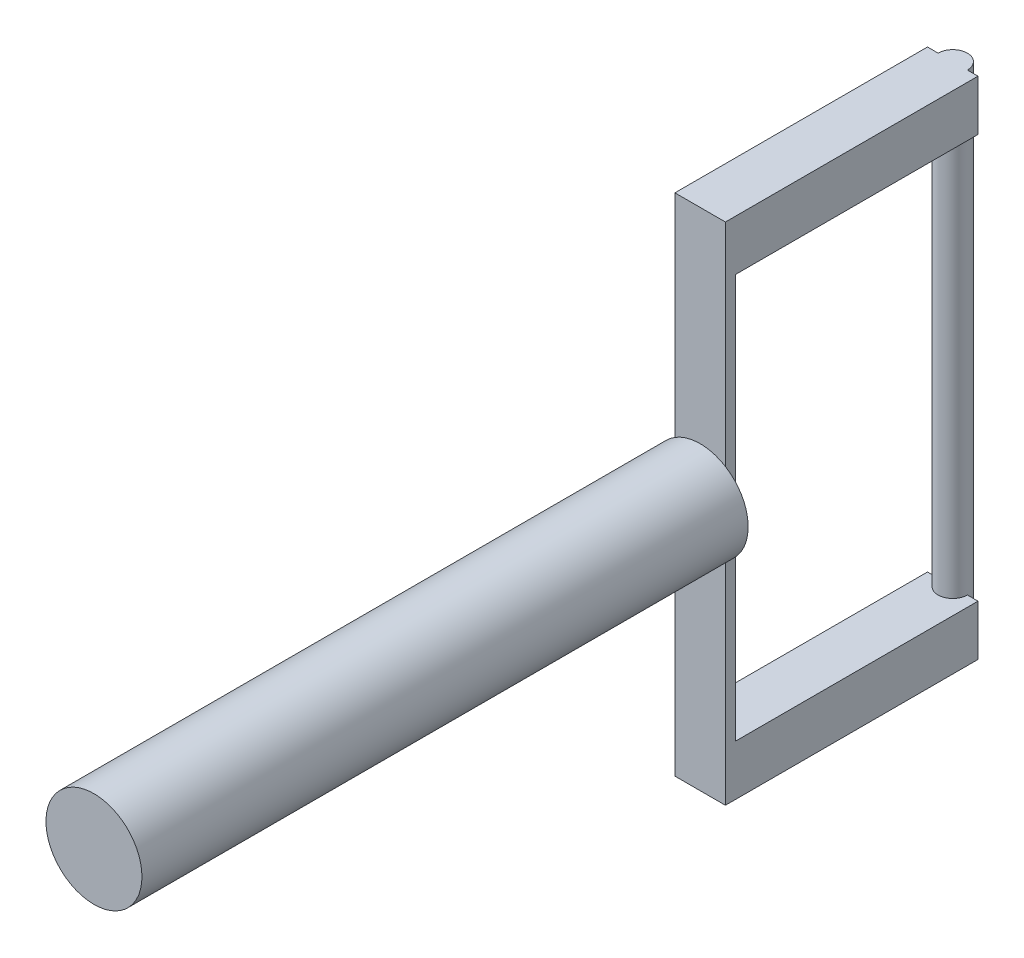
ISO-10303-21;
HEADER;
FILE_DESCRIPTION(('STEP AP214'),'2;1');
FILE_NAME('part.step','',(''),(''),'','','');
FILE_SCHEMA(('AUTOMOTIVE_DESIGN { 1 0 10303 214 1 1 1 1 }'));
ENDSEC;
DATA;
#1=APPLICATION_CONTEXT('core data for automotive mechanical design processes');
#2=APPLICATION_PROTOCOL_DEFINITION('international standard','automotive_design',2000,#1);
#3=PRODUCT_CONTEXT('',#1,'mechanical');
#4=PRODUCT('Part','Part','',(#3));
#5=PRODUCT_RELATED_PRODUCT_CATEGORY('part','',(#4));
#6=PRODUCT_DEFINITION_FORMATION('','',#4);
#7=PRODUCT_DEFINITION_CONTEXT('part definition',#1,'design');
#8=PRODUCT_DEFINITION('design','',#6,#7);
#9=PRODUCT_DEFINITION_SHAPE('','',#8);
#10=(LENGTH_UNIT() NAMED_UNIT(*) SI_UNIT(.MILLI.,.METRE.));
#11=(NAMED_UNIT(*) PLANE_ANGLE_UNIT() SI_UNIT($,.RADIAN.));
#12=(NAMED_UNIT(*) SI_UNIT($,.STERADIAN.) SOLID_ANGLE_UNIT());
#13=UNCERTAINTY_MEASURE_WITH_UNIT(LENGTH_MEASURE(1.E-05),#10,'distance_accuracy_value','');
#14=(GEOMETRIC_REPRESENTATION_CONTEXT(3) GLOBAL_UNCERTAINTY_ASSIGNED_CONTEXT((#13)) GLOBAL_UNIT_ASSIGNED_CONTEXT((#10,
#11,#12)) REPRESENTATION_CONTEXT('',''));
#15=CARTESIAN_POINT('',(0.,0.,0.));
#16=DIRECTION('',(0.,0.,1.));
#17=DIRECTION('',(1.,0.,0.));
#18=AXIS2_PLACEMENT_3D('',#15,#16,#17);
#19=CARTESIAN_POINT('',(0.,0.,5.));
#20=DIRECTION('',(0.,0.,1.));
#21=DIRECTION('',(1.,0.,0.));
#22=AXIS2_PLACEMENT_3D('',#19,#20,#21);
#23=PLANE('',#22);
#24=CARTESIAN_POINT('',(0.,0.,5.));
#25=DIRECTION('',(0.,0.,1.));
#26=DIRECTION('',(1.,0.,0.));
#27=AXIS2_PLACEMENT_3D('',#24,#25,#26);
#28=CIRCLE('',#27,0.95);
#29=CARTESIAN_POINT('',(0.500000000000001,0.807774721070175,5.));
#30=VERTEX_POINT('',#29);
#31=CARTESIAN_POINT('',(-0.499999999999999,0.807774721070176,5.));
#32=VERTEX_POINT('',#31);
#33=EDGE_CURVE('E47',#30,#32,#28,.T.);
#34=ORIENTED_EDGE('',*,*,#33,.F.);
#35=DIRECTION('',(0.,1.,0.));
#36=VECTOR('',#35,1.);
#37=CARTESIAN_POINT('',(0.5,5.,5.));
#38=LINE('',#37,#36);
#39=CARTESIAN_POINT('',(0.5,5.,5.));
#40=VERTEX_POINT('',#39);
#41=EDGE_CURVE('E149',#30,#40,#38,.T.);
#42=ORIENTED_EDGE('',*,*,#41,.T.);
#43=DIRECTION('',(-1.,0.,0.));
#44=VECTOR('',#43,1.);
#45=CARTESIAN_POINT('',(-0.5,5.,5.));
#46=LINE('',#45,#44);
#47=CARTESIAN_POINT('',(-0.5,5.,5.));
#48=VERTEX_POINT('',#47);
#49=EDGE_CURVE('E146',#40,#48,#46,.T.);
#50=ORIENTED_EDGE('',*,*,#49,.T.);
#51=DIRECTION('',(0.,-1.,0.));
#52=VECTOR('',#51,1.);
#53=CARTESIAN_POINT('',(-0.5,5.,5.));
#54=LINE('',#53,#52);
#55=EDGE_CURVE('E213',#48,#32,#54,.T.);
#56=ORIENTED_EDGE('',*,*,#55,.T.);
#57=EDGE_LOOP('',(#34,#42,#50,#56));
#58=FACE_BOUND('',#57,.T.);
#59=ADVANCED_FACE('F37',(#58),#23,.T.);
#60=CARTESIAN_POINT('',(-0.5,4.,5.));
#61=DIRECTION('',(0.,1.,0.));
#62=DIRECTION('',(0.,0.,1.));
#63=AXIS2_PLACEMENT_3D('',#60,#61,#62);
#64=PLANE('',#63);
#65=DIRECTION('',(-1.,0.,0.));
#66=VECTOR('',#65,1.);
#67=CARTESIAN_POINT('',(-0.5,4.,4.8));
#68=LINE('',#67,#66);
#69=CARTESIAN_POINT('',(0.5,4.,4.8));
#70=VERTEX_POINT('',#69);
#71=CARTESIAN_POINT('',(-0.5,4.,4.8));
#72=VERTEX_POINT('',#71);
#73=EDGE_CURVE('E172',#70,#72,#68,.T.);
#74=ORIENTED_EDGE('',*,*,#73,.T.);
#75=DIRECTION('',(0.,0.,-1.));
#76=VECTOR('',#75,1.);
#77=CARTESIAN_POINT('',(-0.5,4.,5.));
#78=LINE('',#77,#76);
#79=CARTESIAN_POINT('',(-0.5,4.,0.));
#80=VERTEX_POINT('',#79);
#81=EDGE_CURVE('E229',#72,#80,#78,.T.);
#82=ORIENTED_EDGE('',*,*,#81,.T.);
#83=DIRECTION('',(1.,0.,0.));
#84=VECTOR('',#83,1.);
#85=CARTESIAN_POINT('',(-0.5,4.,0.));
#86=LINE('',#85,#84);
#87=CARTESIAN_POINT('',(-0.29,4.,0.));
#88=VERTEX_POINT('',#87);
#89=EDGE_CURVE('E225',#80,#88,#86,.T.);
#90=ORIENTED_EDGE('',*,*,#89,.T.);
#91=CARTESIAN_POINT('',(0.,4.,0.));
#92=DIRECTION('',(0.,1.,0.));
#93=DIRECTION('',(0.,0.,1.));
#94=AXIS2_PLACEMENT_3D('',#91,#92,#93);
#95=CIRCLE('',#94,0.29);
#96=CARTESIAN_POINT('',(0.29,4.,0.));
#97=VERTEX_POINT('',#96);
#98=EDGE_CURVE('E247',#88,#97,#95,.T.);
#99=ORIENTED_EDGE('',*,*,#98,.T.);
#100=CARTESIAN_POINT('',(0.5,4.,0.));
#101=VERTEX_POINT('',#100);
#102=EDGE_CURVE('E224',#97,#101,#86,.T.);
#103=ORIENTED_EDGE('',*,*,#102,.T.);
#104=DIRECTION('',(0.,0.,-1.));
#105=VECTOR('',#104,1.);
#106=CARTESIAN_POINT('',(0.5,4.,5.));
#107=LINE('',#106,#105);
#108=EDGE_CURVE('E215',#70,#101,#107,.T.);
#109=ORIENTED_EDGE('',*,*,#108,.F.);
#110=EDGE_LOOP('',(#74,#82,#90,#99,#103,#109));
#111=FACE_BOUND('',#110,.T.);
#112=ADVANCED_FACE('F290',(#111),#64,.F.);
#113=CARTESIAN_POINT('',(0.5,-4.,5.));
#114=DIRECTION('',(0.,-1.,0.));
#115=DIRECTION('',(0.,0.,-1.));
#116=AXIS2_PLACEMENT_3D('',#113,#114,#115);
#117=PLANE('',#116);
#118=DIRECTION('',(1.,0.,0.));
#119=VECTOR('',#118,1.);
#120=CARTESIAN_POINT('',(-0.499999999999999,-4.,4.8));
#121=LINE('',#120,#119);
#122=CARTESIAN_POINT('',(-0.499999999999999,-4.,4.8));
#123=VERTEX_POINT('',#122);
#124=CARTESIAN_POINT('',(0.500000000000001,-4.,4.8));
#125=VERTEX_POINT('',#124);
#126=EDGE_CURVE('E177',#123,#125,#121,.T.);
#127=ORIENTED_EDGE('',*,*,#126,.T.);
#128=DIRECTION('',(0.,0.,-1.));
#129=VECTOR('',#128,1.);
#130=CARTESIAN_POINT('',(0.5,-4.,5.));
#131=LINE('',#130,#129);
#132=CARTESIAN_POINT('',(0.5,-4.,0.));
#133=VERTEX_POINT('',#132);
#134=EDGE_CURVE('E197',#125,#133,#131,.T.);
#135=ORIENTED_EDGE('',*,*,#134,.T.);
#136=DIRECTION('',(-1.,0.,0.));
#137=VECTOR('',#136,1.);
#138=CARTESIAN_POINT('',(0.5,-4.,0.));
#139=LINE('',#138,#137);
#140=CARTESIAN_POINT('',(0.29,-4.,0.));
#141=VERTEX_POINT('',#140);
#142=EDGE_CURVE('E183',#133,#141,#139,.T.);
#143=ORIENTED_EDGE('',*,*,#142,.T.);
#144=CARTESIAN_POINT('',(0.,-4.,0.));
#145=DIRECTION('',(0.,-1.,0.));
#146=DIRECTION('',(0.,0.,-1.));
#147=AXIS2_PLACEMENT_3D('',#144,#145,#146);
#148=CIRCLE('',#147,0.29);
#149=CARTESIAN_POINT('',(-0.29,-4.,0.));
#150=VERTEX_POINT('',#149);
#151=EDGE_CURVE('E41',#141,#150,#148,.T.);
#152=ORIENTED_EDGE('',*,*,#151,.T.);
#153=CARTESIAN_POINT('',(-0.5,-4.,0.));
#154=VERTEX_POINT('',#153);
#155=EDGE_CURVE('E193',#150,#154,#139,.T.);
#156=ORIENTED_EDGE('',*,*,#155,.T.);
#157=DIRECTION('',(0.,0.,-1.));
#158=VECTOR('',#157,1.);
#159=CARTESIAN_POINT('',(-0.5,-4.,5.));
#160=LINE('',#159,#158);
#161=EDGE_CURVE('E182',#123,#154,#160,.T.);
#162=ORIENTED_EDGE('',*,*,#161,.F.);
#163=EDGE_LOOP('',(#127,#135,#143,#152,#156,#162));
#164=FACE_BOUND('',#163,.T.);
#165=ADVANCED_FACE('F257',(#164),#117,.F.);
#166=CARTESIAN_POINT('',(0.,5.,0.));
#167=DIRECTION('',(0.,-1.,0.));
#168=DIRECTION('',(0.,0.,-1.));
#169=AXIS2_PLACEMENT_3D('',#166,#167,#168);
#170=CYLINDRICAL_SURFACE('',#169,0.29);
#171=ORIENTED_EDGE('',*,*,#151,.F.);
#172=DIRECTION('',(0.,-1.,0.));
#173=VECTOR('',#172,1.);
#174=CARTESIAN_POINT('',(0.29,5.,0.));
#175=LINE('',#174,#173);
#176=CARTESIAN_POINT('',(0.29,-5.,0.));
#177=VERTEX_POINT('',#176);
#178=EDGE_CURVE('E207',#141,#177,#175,.T.);
#179=ORIENTED_EDGE('',*,*,#178,.T.);
#180=CARTESIAN_POINT('',(0.,-5.,0.));
#181=DIRECTION('',(0.,1.,0.));
#182=DIRECTION('',(0.,0.,1.));
#183=AXIS2_PLACEMENT_3D('',#180,#181,#182);
#184=CIRCLE('',#183,0.29);
#185=CARTESIAN_POINT('',(-0.29,-5.,0.));
#186=VERTEX_POINT('',#185);
#187=EDGE_CURVE('E243',#177,#186,#184,.T.);
#188=ORIENTED_EDGE('',*,*,#187,.T.);
#189=DIRECTION('',(0.,-1.,0.));
#190=VECTOR('',#189,1.);
#191=CARTESIAN_POINT('',(-0.29,5.,0.));
#192=LINE('',#191,#190);
#193=EDGE_CURVE('E204',#186,#150,#192,.F.);
#194=ORIENTED_EDGE('',*,*,#193,.T.);
#195=EDGE_LOOP('',(#171,#179,#188,#194));
#196=FACE_BOUND('',#195,.T.);
#197=DIRECTION('',(0.,-1.,0.));
#198=VECTOR('',#197,1.);
#199=CARTESIAN_POINT('',(-0.29,5.,0.));
#200=LINE('',#199,#198);
#201=CARTESIAN_POINT('',(-0.29,5.,0.));
#202=VERTEX_POINT('',#201);
#203=EDGE_CURVE('E240',#202,#88,#200,.T.);
#204=ORIENTED_EDGE('',*,*,#203,.F.);
#205=CARTESIAN_POINT('',(0.,5.,0.));
#206=DIRECTION('',(0.,1.,0.));
#207=DIRECTION('',(0.,0.,1.));
#208=AXIS2_PLACEMENT_3D('',#205,#206,#207);
#209=CIRCLE('',#208,0.29);
#210=CARTESIAN_POINT('',(0.29,5.,0.));
#211=VERTEX_POINT('',#210);
#212=EDGE_CURVE('E244',#211,#202,#209,.T.);
#213=ORIENTED_EDGE('',*,*,#212,.F.);
#214=DIRECTION('',(0.,-1.,0.));
#215=VECTOR('',#214,1.);
#216=CARTESIAN_POINT('',(0.29,5.,0.));
#217=LINE('',#216,#215);
#218=EDGE_CURVE('E237',#97,#211,#217,.F.);
#219=ORIENTED_EDGE('',*,*,#218,.F.);
#220=ORIENTED_EDGE('',*,*,#98,.F.);
#221=EDGE_LOOP('',(#204,#213,#219,#220));
#222=FACE_BOUND('',#221,.T.);
#223=ADVANCED_FACE('F39',(#196,#222),#170,.T.);
#224=CARTESIAN_POINT('',(0.,5.,0.));
#225=DIRECTION('',(0.,1.,0.));
#226=DIRECTION('',(0.,0.,1.));
#227=AXIS2_PLACEMENT_3D('',#224,#225,#226);
#228=PLANE('',#227);
#229=ORIENTED_EDGE('',*,*,#212,.T.);
#230=DIRECTION('',(-1.,0.,0.));
#231=VECTOR('',#230,1.);
#232=CARTESIAN_POINT('',(-0.5,5.,0.));
#233=LINE('',#232,#231);
#234=CARTESIAN_POINT('',(-0.5,5.,0.));
#235=VERTEX_POINT('',#234);
#236=EDGE_CURVE('E217',#202,#235,#233,.T.);
#237=ORIENTED_EDGE('',*,*,#236,.T.);
#238=DIRECTION('',(0.,0.,-1.));
#239=VECTOR('',#238,1.);
#240=CARTESIAN_POINT('',(-0.5,5.,5.));
#241=LINE('',#240,#239);
#242=EDGE_CURVE('E231',#48,#235,#241,.T.);
#243=ORIENTED_EDGE('',*,*,#242,.F.);
#244=ORIENTED_EDGE('',*,*,#49,.F.);
#245=DIRECTION('',(0.,0.,-1.));
#246=VECTOR('',#245,1.);
#247=CARTESIAN_POINT('',(0.5,5.,5.));
#248=LINE('',#247,#246);
#249=CARTESIAN_POINT('',(0.5,5.,0.));
#250=VERTEX_POINT('',#249);
#251=EDGE_CURVE('E234',#40,#250,#248,.T.);
#252=ORIENTED_EDGE('',*,*,#251,.T.);
#253=EDGE_CURVE('E218',#250,#211,#233,.T.);
#254=ORIENTED_EDGE('',*,*,#253,.T.);
#255=EDGE_LOOP('',(#229,#237,#243,#244,#252,#254));
#256=FACE_BOUND('',#255,.T.);
#257=ADVANCED_FACE('F307',(#256),#228,.T.);
#258=CARTESIAN_POINT('',(0.,-5.,0.));
#259=DIRECTION('',(0.,1.,0.));
#260=DIRECTION('',(0.,0.,1.));
#261=AXIS2_PLACEMENT_3D('',#258,#259,#260);
#262=PLANE('',#261);
#263=ORIENTED_EDGE('',*,*,#187,.F.);
#264=DIRECTION('',(1.,0.,0.));
#265=VECTOR('',#264,1.);
#266=CARTESIAN_POINT('',(0.5,-5.,0.));
#267=LINE('',#266,#265);
#268=CARTESIAN_POINT('',(0.5,-5.,0.));
#269=VERTEX_POINT('',#268);
#270=EDGE_CURVE('E186',#177,#269,#267,.T.);
#271=ORIENTED_EDGE('',*,*,#270,.T.);
#272=DIRECTION('',(0.,0.,-1.));
#273=VECTOR('',#272,1.);
#274=CARTESIAN_POINT('',(0.5,-5.,5.));
#275=LINE('',#274,#273);
#276=CARTESIAN_POINT('',(0.5,-5.,5.));
#277=VERTEX_POINT('',#276);
#278=EDGE_CURVE('E199',#277,#269,#275,.T.);
#279=ORIENTED_EDGE('',*,*,#278,.F.);
#280=DIRECTION('',(1.,0.,0.));
#281=VECTOR('',#280,1.);
#282=CARTESIAN_POINT('',(0.5,-5.,5.));
#283=LINE('',#282,#281);
#284=CARTESIAN_POINT('',(-0.5,-5.,5.));
#285=VERTEX_POINT('',#284);
#286=EDGE_CURVE('E142',#285,#277,#283,.T.);
#287=ORIENTED_EDGE('',*,*,#286,.F.);
#288=DIRECTION('',(0.,0.,-1.));
#289=VECTOR('',#288,1.);
#290=CARTESIAN_POINT('',(-0.5,-5.,5.));
#291=LINE('',#290,#289);
#292=CARTESIAN_POINT('',(-0.5,-5.,0.));
#293=VERTEX_POINT('',#292);
#294=EDGE_CURVE('E201',#285,#293,#291,.T.);
#295=ORIENTED_EDGE('',*,*,#294,.T.);
#296=EDGE_CURVE('E187',#293,#186,#267,.T.);
#297=ORIENTED_EDGE('',*,*,#296,.T.);
#298=EDGE_LOOP('',(#263,#271,#279,#287,#295,#297));
#299=FACE_BOUND('',#298,.T.);
#300=ADVANCED_FACE('F267',(#299),#262,.F.);
#301=CARTESIAN_POINT('',(0.,0.,0.));
#302=DIRECTION('',(0.,0.,1.));
#303=DIRECTION('',(1.,0.,0.));
#304=AXIS2_PLACEMENT_3D('',#301,#302,#303);
#305=PLANE('',#304);
#306=ORIENTED_EDGE('',*,*,#236,.F.);
#307=ORIENTED_EDGE('',*,*,#203,.T.);
#308=ORIENTED_EDGE('',*,*,#89,.F.);
#309=DIRECTION('',(0.,-1.,0.));
#310=VECTOR('',#309,1.);
#311=CARTESIAN_POINT('',(-0.5,5.,0.));
#312=LINE('',#311,#310);
#313=EDGE_CURVE('E221',#235,#80,#312,.T.);
#314=ORIENTED_EDGE('',*,*,#313,.F.);
#315=EDGE_LOOP('',(#306,#307,#308,#314));
#316=FACE_BOUND('',#315,.T.);
#317=ADVANCED_FACE('F299',(#316),#305,.F.);
#318=ORIENTED_EDGE('',*,*,#102,.F.);
#319=ORIENTED_EDGE('',*,*,#218,.T.);
#320=ORIENTED_EDGE('',*,*,#253,.F.);
#321=DIRECTION('',(0.,1.,0.));
#322=VECTOR('',#321,1.);
#323=CARTESIAN_POINT('',(0.5,5.,0.));
#324=LINE('',#323,#322);
#325=EDGE_CURVE('E209',#101,#250,#324,.T.);
#326=ORIENTED_EDGE('',*,*,#325,.F.);
#327=EDGE_LOOP('',(#318,#319,#320,#326));
#328=FACE_BOUND('',#327,.T.);
#329=ADVANCED_FACE('F301',(#328),#305,.F.);
#330=CARTESIAN_POINT('',(0.5,5.,5.));
#331=DIRECTION('',(-1.,0.,0.));
#332=DIRECTION('',(0.,-1.,0.));
#333=AXIS2_PLACEMENT_3D('',#330,#331,#332);
#334=PLANE('',#333);
#335=ORIENTED_EDGE('',*,*,#325,.T.);
#336=ORIENTED_EDGE('',*,*,#251,.F.);
#337=ORIENTED_EDGE('',*,*,#41,.F.);
#338=CARTESIAN_POINT('',(0.500000000000002,-0.807774721070175,5.));
#339=VERTEX_POINT('',#338);
#340=EDGE_CURVE('E147',#339,#30,#38,.T.);
#341=ORIENTED_EDGE('',*,*,#340,.F.);
#342=EDGE_CURVE('E138',#277,#339,#38,.T.);
#343=ORIENTED_EDGE('',*,*,#342,.F.);
#344=ORIENTED_EDGE('',*,*,#278,.T.);
#345=DIRECTION('',(0.,1.,0.));
#346=VECTOR('',#345,1.);
#347=CARTESIAN_POINT('',(0.5,-4.,0.));
#348=LINE('',#347,#346);
#349=EDGE_CURVE('E190',#269,#133,#348,.T.);
#350=ORIENTED_EDGE('',*,*,#349,.T.);
#351=ORIENTED_EDGE('',*,*,#134,.F.);
#352=DIRECTION('',(0.,1.,0.));
#353=VECTOR('',#352,1.);
#354=CARTESIAN_POINT('',(0.5,4.,4.8));
#355=LINE('',#354,#353);
#356=EDGE_CURVE('E169',#125,#70,#355,.T.);
#357=ORIENTED_EDGE('',*,*,#356,.T.);
#358=ORIENTED_EDGE('',*,*,#108,.T.);
#359=EDGE_LOOP('',(#335,#336,#337,#341,#343,#344,#350,#351,#357,#358));
#360=FACE_BOUND('',#359,.T.);
#361=ADVANCED_FACE('F154',(#360),#334,.F.);
#362=CARTESIAN_POINT('',(-0.5,5.,5.));
#363=DIRECTION('',(1.,0.,0.));
#364=DIRECTION('',(0.,1.,0.));
#365=AXIS2_PLACEMENT_3D('',#362,#363,#364);
#366=PLANE('',#365);
#367=ORIENTED_EDGE('',*,*,#313,.T.);
#368=ORIENTED_EDGE('',*,*,#81,.F.);
#369=DIRECTION('',(0.,-1.,0.));
#370=VECTOR('',#369,1.);
#371=CARTESIAN_POINT('',(-0.5,4.,4.8));
#372=LINE('',#371,#370);
#373=EDGE_CURVE('E175',#72,#123,#372,.T.);
#374=ORIENTED_EDGE('',*,*,#373,.T.);
#375=ORIENTED_EDGE('',*,*,#161,.T.);
#376=DIRECTION('',(0.,-1.,0.));
#377=VECTOR('',#376,1.);
#378=CARTESIAN_POINT('',(-0.5,-4.,0.));
#379=LINE('',#378,#377);
#380=EDGE_CURVE('E180',#154,#293,#379,.T.);
#381=ORIENTED_EDGE('',*,*,#380,.T.);
#382=ORIENTED_EDGE('',*,*,#294,.F.);
#383=CARTESIAN_POINT('',(-0.499999999999999,-0.807774721070176,5.));
#384=VERTEX_POINT('',#383);
#385=EDGE_CURVE('E212',#384,#285,#54,.T.);
#386=ORIENTED_EDGE('',*,*,#385,.F.);
#387=EDGE_CURVE('E60',#32,#384,#54,.T.);
#388=ORIENTED_EDGE('',*,*,#387,.F.);
#389=ORIENTED_EDGE('',*,*,#55,.F.);
#390=ORIENTED_EDGE('',*,*,#242,.T.);
#391=EDGE_LOOP('',(#367,#368,#374,#375,#381,#382,#386,#388,#389,#390));
#392=FACE_BOUND('',#391,.T.);
#393=ADVANCED_FACE('F269',(#392),#366,.F.);
#394=EDGE_CURVE('E11',#384,#339,#28,.T.);
#395=ORIENTED_EDGE('',*,*,#394,.F.);
#396=ORIENTED_EDGE('',*,*,#385,.T.);
#397=ORIENTED_EDGE('',*,*,#286,.T.);
#398=ORIENTED_EDGE('',*,*,#342,.T.);
#399=EDGE_LOOP('',(#395,#396,#397,#398));
#400=FACE_BOUND('',#399,.T.);
#401=ADVANCED_FACE('F140',(#400),#23,.T.);
#402=CARTESIAN_POINT('',(0.,0.,0.));
#403=DIRECTION('',(0.,0.,-1.));
#404=DIRECTION('',(-1.,0.,0.));
#405=AXIS2_PLACEMENT_3D('',#402,#403,#404);
#406=PLANE('',#405);
#407=ORIENTED_EDGE('',*,*,#178,.F.);
#408=ORIENTED_EDGE('',*,*,#142,.F.);
#409=ORIENTED_EDGE('',*,*,#349,.F.);
#410=ORIENTED_EDGE('',*,*,#270,.F.);
#411=EDGE_LOOP('',(#407,#408,#409,#410));
#412=FACE_BOUND('',#411,.T.);
#413=ADVANCED_FACE('F277',(#412),#406,.T.);
#414=ORIENTED_EDGE('',*,*,#193,.F.);
#415=ORIENTED_EDGE('',*,*,#296,.F.);
#416=ORIENTED_EDGE('',*,*,#380,.F.);
#417=ORIENTED_EDGE('',*,*,#155,.F.);
#418=EDGE_LOOP('',(#414,#415,#416,#417));
#419=FACE_BOUND('',#418,.T.);
#420=ADVANCED_FACE('F265',(#419),#406,.T.);
#421=CARTESIAN_POINT('',(0.,0.,4.8));
#422=DIRECTION('',(0.,0.,1.));
#423=DIRECTION('',(1.,0.,0.));
#424=AXIS2_PLACEMENT_3D('',#421,#422,#423);
#425=PLANE('',#424);
#426=ORIENTED_EDGE('',*,*,#356,.F.);
#427=ORIENTED_EDGE('',*,*,#126,.F.);
#428=ORIENTED_EDGE('',*,*,#373,.F.);
#429=ORIENTED_EDGE('',*,*,#73,.F.);
#430=EDGE_LOOP('',(#426,#427,#428,#429));
#431=FACE_BOUND('',#430,.T.);
#432=ADVANCED_FACE('F284',(#431),#425,.F.);
#433=CARTESIAN_POINT('',(0.,0.,5.));
#434=DIRECTION('',(0.,0.,1.));
#435=DIRECTION('',(1.,0.,0.));
#436=AXIS2_PLACEMENT_3D('',#433,#434,#435);
#437=PLANE('',#436);
#438=EDGE_CURVE('E158',#339,#30,#28,.T.);
#439=ORIENTED_EDGE('',*,*,#438,.F.);
#440=ORIENTED_EDGE('',*,*,#340,.T.);
#441=EDGE_LOOP('',(#439,#440));
#442=FACE_BOUND('',#441,.T.);
#443=ADVANCED_FACE('F159',(#442),#437,.F.);
#444=EDGE_CURVE('E48',#32,#384,#28,.T.);
#445=ORIENTED_EDGE('',*,*,#444,.F.);
#446=ORIENTED_EDGE('',*,*,#387,.T.);
#447=EDGE_LOOP('',(#445,#446));
#448=FACE_BOUND('',#447,.T.);
#449=ADVANCED_FACE('F373',(#448),#437,.F.);
#450=CARTESIAN_POINT('',(0.,0.,17.));
#451=DIRECTION('',(0.,0.,-1.));
#452=DIRECTION('',(-1.,0.,0.));
#453=AXIS2_PLACEMENT_3D('',#450,#451,#452);
#454=CYLINDRICAL_SURFACE('',#453,0.95);
#455=CARTESIAN_POINT('',(0.,0.,17.));
#456=DIRECTION('',(0.,0.,1.));
#457=DIRECTION('',(1.,0.,0.));
#458=AXIS2_PLACEMENT_3D('',#455,#456,#457);
#459=CIRCLE('',#458,0.95);
#460=CARTESIAN_POINT('',(0.95,0.,17.));
#461=VERTEX_POINT('',#460);
#462=EDGE_CURVE('E166',#461,#461,#459,.T.);
#463=ORIENTED_EDGE('',*,*,#462,.F.);
#464=EDGE_LOOP('',(#463));
#465=FACE_BOUND('',#464,.T.);
#466=ORIENTED_EDGE('',*,*,#33,.T.);
#467=ORIENTED_EDGE('',*,*,#444,.T.);
#468=ORIENTED_EDGE('',*,*,#394,.T.);
#469=ORIENTED_EDGE('',*,*,#438,.T.);
#470=EDGE_LOOP('',(#466,#467,#468,#469));
#471=FACE_BOUND('',#470,.T.);
#472=ADVANCED_FACE('F163',(#465,#471),#454,.T.);
#473=CARTESIAN_POINT('',(0.,0.,17.));
#474=DIRECTION('',(0.,0.,1.));
#475=DIRECTION('',(1.,0.,0.));
#476=AXIS2_PLACEMENT_3D('',#473,#474,#475);
#477=PLANE('',#476);
#478=ORIENTED_EDGE('',*,*,#462,.T.);
#479=EDGE_LOOP('',(#478));
#480=FACE_BOUND('',#479,.T.);
#481=ADVANCED_FACE('F385',(#480),#477,.T.);
#482=CLOSED_SHELL('',(#59,#112,#165,#223,#257,#300,#317,#329,#361,#393,#401,#413,#420,#432,#443,
#449,#472,#481));
#483=MANIFOLD_SOLID_BREP('B2',#482);
#484=ADVANCED_BREP_SHAPE_REPRESENTATION('',(#18,#483),#14);
#485=SHAPE_DEFINITION_REPRESENTATION(#9,#484);
ENDSEC;
END-ISO-10303-21;
